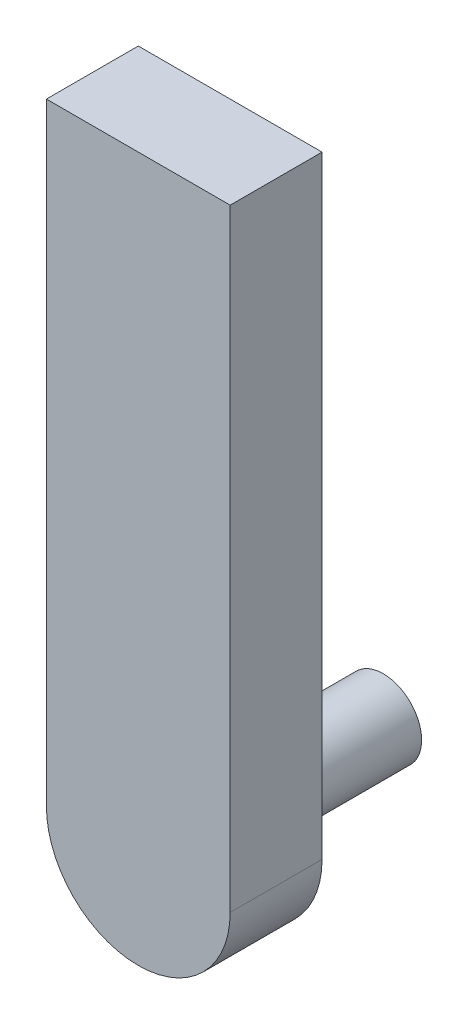
ISO-10303-21;
HEADER;
FILE_DESCRIPTION(('STEP AP214'),'2;1');
FILE_NAME('part.step','',(''),(''),'','','');
FILE_SCHEMA(('AUTOMOTIVE_DESIGN { 1 0 10303 214 1 1 1 1 }'));
ENDSEC;
DATA;
#1=APPLICATION_CONTEXT('core data for automotive mechanical design processes');
#2=APPLICATION_PROTOCOL_DEFINITION('international standard','automotive_design',2000,#1);
#3=PRODUCT_CONTEXT('',#1,'mechanical');
#4=PRODUCT('Part','Part','',(#3));
#5=PRODUCT_RELATED_PRODUCT_CATEGORY('part','',(#4));
#6=PRODUCT_DEFINITION_FORMATION('','',#4);
#7=PRODUCT_DEFINITION_CONTEXT('part definition',#1,'design');
#8=PRODUCT_DEFINITION('design','',#6,#7);
#9=PRODUCT_DEFINITION_SHAPE('','',#8);
#10=(LENGTH_UNIT() NAMED_UNIT(*) SI_UNIT(.MILLI.,.METRE.));
#11=(NAMED_UNIT(*) PLANE_ANGLE_UNIT() SI_UNIT($,.RADIAN.));
#12=(NAMED_UNIT(*) SI_UNIT($,.STERADIAN.) SOLID_ANGLE_UNIT());
#13=UNCERTAINTY_MEASURE_WITH_UNIT(LENGTH_MEASURE(1.E-05),#10,'distance_accuracy_value','');
#14=(GEOMETRIC_REPRESENTATION_CONTEXT(3) GLOBAL_UNCERTAINTY_ASSIGNED_CONTEXT((#13)) GLOBAL_UNIT_ASSIGNED_CONTEXT((#10,
#11,#12)) REPRESENTATION_CONTEXT('',''));
#15=CARTESIAN_POINT('',(0.,0.,0.));
#16=DIRECTION('',(0.,0.,1.));
#17=DIRECTION('',(1.,0.,0.));
#18=AXIS2_PLACEMENT_3D('',#15,#16,#17);
#19=CARTESIAN_POINT('',(0.,0.,0.));
#20=DIRECTION('',(0.,0.,1.));
#21=DIRECTION('',(1.,0.,0.));
#22=AXIS2_PLACEMENT_3D('',#19,#20,#21);
#23=PLANE('',#22);
#24=DIRECTION('',(-1.,0.,0.));
#25=VECTOR('',#24,1.);
#26=CARTESIAN_POINT('',(-6.,40.,0.));
#27=LINE('',#26,#25);
#28=CARTESIAN_POINT('',(6.,40.,0.));
#29=VERTEX_POINT('',#28);
#30=CARTESIAN_POINT('',(-6.,40.,0.));
#31=VERTEX_POINT('',#30);
#32=EDGE_CURVE('E97',#29,#31,#27,.T.);
#33=ORIENTED_EDGE('',*,*,#32,.F.);
#34=DIRECTION('',(0.,1.,0.));
#35=VECTOR('',#34,1.);
#36=CARTESIAN_POINT('',(6.,0.,0.));
#37=LINE('',#36,#35);
#38=CARTESIAN_POINT('',(6.,0.,0.));
#39=VERTEX_POINT('',#38);
#40=EDGE_CURVE('E70',#39,#29,#37,.T.);
#41=ORIENTED_EDGE('',*,*,#40,.F.);
#42=CARTESIAN_POINT('',(0.,0.,0.));
#43=DIRECTION('',(0.,0.,1.));
#44=DIRECTION('',(1.,0.,0.));
#45=AXIS2_PLACEMENT_3D('',#42,#43,#44);
#46=CIRCLE('',#45,6.);
#47=CARTESIAN_POINT('',(-6.,0.,0.));
#48=VERTEX_POINT('',#47);
#49=EDGE_CURVE('E64',#48,#39,#46,.T.);
#50=ORIENTED_EDGE('',*,*,#49,.F.);
#51=DIRECTION('',(0.,-1.,0.));
#52=VECTOR('',#51,1.);
#53=CARTESIAN_POINT('',(-6.,40.,0.));
#54=LINE('',#53,#52);
#55=EDGE_CURVE('E88',#31,#48,#54,.T.);
#56=ORIENTED_EDGE('',*,*,#55,.F.);
#57=EDGE_LOOP('',(#33,#41,#50,#56));
#58=FACE_BOUND('',#57,.T.);
#59=CARTESIAN_POINT('',(0.,0.,0.));
#60=DIRECTION('',(0.,0.,1.));
#61=DIRECTION('',(1.,0.,0.));
#62=AXIS2_PLACEMENT_3D('',#59,#60,#61);
#63=CIRCLE('',#62,2.5);
#64=CARTESIAN_POINT('',(2.5,0.,0.));
#65=VERTEX_POINT('',#64);
#66=EDGE_CURVE('E11',#65,#65,#63,.F.);
#67=ORIENTED_EDGE('',*,*,#66,.F.);
#68=EDGE_LOOP('',(#67));
#69=FACE_BOUND('',#68,.T.);
#70=ADVANCED_FACE('F30',(#58,#69),#23,.F.);
#71=CARTESIAN_POINT('',(-6.,40.,6.));
#72=DIRECTION('',(0.,-1.,0.));
#73=DIRECTION('',(0.,0.,-1.));
#74=AXIS2_PLACEMENT_3D('',#71,#72,#73);
#75=PLANE('',#74);
#76=ORIENTED_EDGE('',*,*,#32,.T.);
#77=DIRECTION('',(0.,0.,-1.));
#78=VECTOR('',#77,1.);
#79=CARTESIAN_POINT('',(-6.,40.,6.));
#80=LINE('',#79,#78);
#81=CARTESIAN_POINT('',(-6.,40.,6.));
#82=VERTEX_POINT('',#81);
#83=EDGE_CURVE('E39',#82,#31,#80,.T.);
#84=ORIENTED_EDGE('',*,*,#83,.F.);
#85=DIRECTION('',(-1.,0.,0.));
#86=VECTOR('',#85,1.);
#87=CARTESIAN_POINT('',(-6.,40.,6.));
#88=LINE('',#87,#86);
#89=CARTESIAN_POINT('',(6.,40.,6.));
#90=VERTEX_POINT('',#89);
#91=EDGE_CURVE('E83',#90,#82,#88,.T.);
#92=ORIENTED_EDGE('',*,*,#91,.F.);
#93=DIRECTION('',(0.,0.,-1.));
#94=VECTOR('',#93,1.);
#95=CARTESIAN_POINT('',(6.,40.,6.));
#96=LINE('',#95,#94);
#97=EDGE_CURVE('E93',#90,#29,#96,.T.);
#98=ORIENTED_EDGE('',*,*,#97,.T.);
#99=EDGE_LOOP('',(#76,#84,#92,#98));
#100=FACE_BOUND('',#99,.T.);
#101=ADVANCED_FACE('F32',(#100),#75,.F.);
#102=CARTESIAN_POINT('',(-6.,40.,6.));
#103=DIRECTION('',(1.,0.,0.));
#104=DIRECTION('',(0.,1.,0.));
#105=AXIS2_PLACEMENT_3D('',#102,#103,#104);
#106=PLANE('',#105);
#107=ORIENTED_EDGE('',*,*,#55,.T.);
#108=DIRECTION('',(0.,0.,-1.));
#109=VECTOR('',#108,1.);
#110=CARTESIAN_POINT('',(-6.,0.,6.));
#111=LINE('',#110,#109);
#112=CARTESIAN_POINT('',(-6.,0.,6.));
#113=VERTEX_POINT('',#112);
#114=EDGE_CURVE('E86',#113,#48,#111,.T.);
#115=ORIENTED_EDGE('',*,*,#114,.F.);
#116=DIRECTION('',(0.,-1.,0.));
#117=VECTOR('',#116,1.);
#118=CARTESIAN_POINT('',(-6.,40.,6.));
#119=LINE('',#118,#117);
#120=EDGE_CURVE('E78',#82,#113,#119,.T.);
#121=ORIENTED_EDGE('',*,*,#120,.F.);
#122=ORIENTED_EDGE('',*,*,#83,.T.);
#123=EDGE_LOOP('',(#107,#115,#121,#122));
#124=FACE_BOUND('',#123,.T.);
#125=ADVANCED_FACE('F87',(#124),#106,.F.);
#126=CARTESIAN_POINT('',(0.,0.,6.));
#127=DIRECTION('',(0.,0.,-1.));
#128=DIRECTION('',(-1.,0.,0.));
#129=AXIS2_PLACEMENT_3D('',#126,#127,#128);
#130=CYLINDRICAL_SURFACE('',#129,6.);
#131=ORIENTED_EDGE('',*,*,#49,.T.);
#132=DIRECTION('',(0.,0.,-1.));
#133=VECTOR('',#132,1.);
#134=CARTESIAN_POINT('',(6.,0.,6.));
#135=LINE('',#134,#133);
#136=CARTESIAN_POINT('',(6.,0.,6.));
#137=VERTEX_POINT('',#136);
#138=EDGE_CURVE('E89',#137,#39,#135,.T.);
#139=ORIENTED_EDGE('',*,*,#138,.F.);
#140=CARTESIAN_POINT('',(0.,0.,6.));
#141=DIRECTION('',(0.,0.,1.));
#142=DIRECTION('',(1.,0.,0.));
#143=AXIS2_PLACEMENT_3D('',#140,#141,#142);
#144=CIRCLE('',#143,6.);
#145=EDGE_CURVE('E81',#113,#137,#144,.T.);
#146=ORIENTED_EDGE('',*,*,#145,.F.);
#147=ORIENTED_EDGE('',*,*,#114,.T.);
#148=EDGE_LOOP('',(#131,#139,#146,#147));
#149=FACE_BOUND('',#148,.T.);
#150=ADVANCED_FACE('F91',(#149),#130,.T.);
#151=CARTESIAN_POINT('',(6.,0.,6.));
#152=DIRECTION('',(-1.,0.,0.));
#153=DIRECTION('',(0.,0.,1.));
#154=AXIS2_PLACEMENT_3D('',#151,#152,#153);
#155=PLANE('',#154);
#156=ORIENTED_EDGE('',*,*,#40,.T.);
#157=ORIENTED_EDGE('',*,*,#97,.F.);
#158=DIRECTION('',(0.,1.,0.));
#159=VECTOR('',#158,1.);
#160=CARTESIAN_POINT('',(6.,0.,6.));
#161=LINE('',#160,#159);
#162=EDGE_CURVE('E47',#137,#90,#161,.T.);
#163=ORIENTED_EDGE('',*,*,#162,.F.);
#164=ORIENTED_EDGE('',*,*,#138,.T.);
#165=EDGE_LOOP('',(#156,#157,#163,#164));
#166=FACE_BOUND('',#165,.T.);
#167=ADVANCED_FACE('F124',(#166),#155,.F.);
#168=CARTESIAN_POINT('',(0.,0.,6.));
#169=DIRECTION('',(0.,0.,1.));
#170=DIRECTION('',(1.,0.,0.));
#171=AXIS2_PLACEMENT_3D('',#168,#169,#170);
#172=PLANE('',#171);
#173=ORIENTED_EDGE('',*,*,#91,.T.);
#174=ORIENTED_EDGE('',*,*,#120,.T.);
#175=ORIENTED_EDGE('',*,*,#145,.T.);
#176=ORIENTED_EDGE('',*,*,#162,.T.);
#177=EDGE_LOOP('',(#173,#174,#175,#176));
#178=FACE_BOUND('',#177,.T.);
#179=ADVANCED_FACE('F79',(#178),#172,.T.);
#180=CARTESIAN_POINT('',(0.,0.,-10.));
#181=DIRECTION('',(0.,0.,1.));
#182=DIRECTION('',(1.,0.,0.));
#183=AXIS2_PLACEMENT_3D('',#180,#181,#182);
#184=CYLINDRICAL_SURFACE('',#183,2.5);
#185=CARTESIAN_POINT('',(0.,0.,-10.));
#186=DIRECTION('',(0.,0.,-1.));
#187=DIRECTION('',(-1.,0.,0.));
#188=AXIS2_PLACEMENT_3D('',#185,#186,#187);
#189=CIRCLE('',#188,2.5);
#190=CARTESIAN_POINT('',(-2.5,0.,-10.));
#191=VERTEX_POINT('',#190);
#192=EDGE_CURVE('E100',#191,#191,#189,.T.);
#193=ORIENTED_EDGE('',*,*,#192,.F.);
#194=EDGE_LOOP('',(#193));
#195=FACE_BOUND('',#194,.T.);
#196=ORIENTED_EDGE('',*,*,#66,.T.);
#197=EDGE_LOOP('',(#196));
#198=FACE_BOUND('',#197,.T.);
#199=ADVANCED_FACE('F113',(#195,#198),#184,.T.);
#200=CARTESIAN_POINT('',(0.,0.,-10.));
#201=DIRECTION('',(0.,0.,-1.));
#202=DIRECTION('',(-1.,0.,0.));
#203=AXIS2_PLACEMENT_3D('',#200,#201,#202);
#204=PLANE('',#203);
#205=ORIENTED_EDGE('',*,*,#192,.T.);
#206=EDGE_LOOP('',(#205));
#207=FACE_BOUND('',#206,.T.);
#208=ADVANCED_FACE('F115',(#207),#204,.T.);
#209=CLOSED_SHELL('',(#70,#101,#125,#150,#167,#179,#199,#208));
#210=MANIFOLD_SOLID_BREP('B2',#209);
#211=ADVANCED_BREP_SHAPE_REPRESENTATION('',(#18,#210),#14);
#212=SHAPE_DEFINITION_REPRESENTATION(#9,#211);
ENDSEC;
END-ISO-10303-21;
